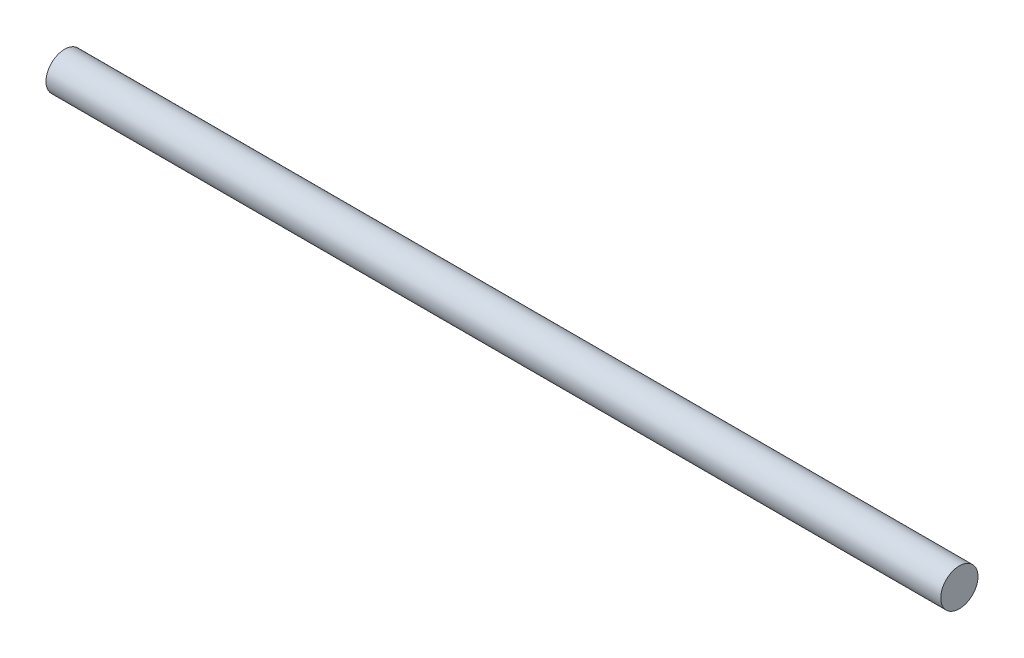
ISO-10303-21;
HEADER;
FILE_DESCRIPTION(('STEP AP214'),'2;1');
FILE_NAME('part.step','',(''),(''),'','','');
FILE_SCHEMA(('AUTOMOTIVE_DESIGN { 1 0 10303 214 1 1 1 1 }'));
ENDSEC;
DATA;
#1=APPLICATION_CONTEXT('core data for automotive mechanical design processes');
#2=APPLICATION_PROTOCOL_DEFINITION('international standard','automotive_design',2000,#1);
#3=PRODUCT_CONTEXT('',#1,'mechanical');
#4=PRODUCT('Part','Part','',(#3));
#5=PRODUCT_RELATED_PRODUCT_CATEGORY('part','',(#4));
#6=PRODUCT_DEFINITION_FORMATION('','',#4);
#7=PRODUCT_DEFINITION_CONTEXT('part definition',#1,'design');
#8=PRODUCT_DEFINITION('design','',#6,#7);
#9=PRODUCT_DEFINITION_SHAPE('','',#8);
#10=(LENGTH_UNIT() NAMED_UNIT(*) SI_UNIT(.MILLI.,.METRE.));
#11=(NAMED_UNIT(*) PLANE_ANGLE_UNIT() SI_UNIT($,.RADIAN.));
#12=(NAMED_UNIT(*) SI_UNIT($,.STERADIAN.) SOLID_ANGLE_UNIT());
#13=UNCERTAINTY_MEASURE_WITH_UNIT(LENGTH_MEASURE(1.E-05),#10,'distance_accuracy_value','');
#14=(GEOMETRIC_REPRESENTATION_CONTEXT(3) GLOBAL_UNCERTAINTY_ASSIGNED_CONTEXT((#13)) GLOBAL_UNIT_ASSIGNED_CONTEXT((#10,
#11,#12)) REPRESENTATION_CONTEXT('',''));
#15=CARTESIAN_POINT('',(0.,0.,0.));
#16=DIRECTION('',(0.,0.,1.));
#17=DIRECTION('',(1.,0.,0.));
#18=AXIS2_PLACEMENT_3D('',#15,#16,#17);
#19=CARTESIAN_POINT('',(60.,0.,0.));
#20=DIRECTION('',(-1.,0.,0.));
#21=DIRECTION('',(0.,0.,1.));
#22=AXIS2_PLACEMENT_3D('',#19,#20,#21);
#23=CYLINDRICAL_SURFACE('',#22,1.25);
#24=CARTESIAN_POINT('',(60.,0.,0.));
#25=DIRECTION('',(1.,0.,0.));
#26=DIRECTION('',(0.,0.,-1.));
#27=AXIS2_PLACEMENT_3D('',#24,#25,#26);
#28=CIRCLE('',#27,1.25);
#29=CARTESIAN_POINT('',(60.,0.,-1.25));
#30=VERTEX_POINT('',#29);
#31=EDGE_CURVE('E10',#30,#30,#28,.T.);
#32=ORIENTED_EDGE('',*,*,#31,.F.);
#33=EDGE_LOOP('',(#32));
#34=FACE_BOUND('',#33,.T.);
#35=CARTESIAN_POINT('',(0.,0.,0.));
#36=DIRECTION('',(1.,0.,0.));
#37=DIRECTION('',(0.,0.,-1.));
#38=AXIS2_PLACEMENT_3D('',#35,#36,#37);
#39=CIRCLE('',#38,1.25);
#40=CARTESIAN_POINT('',(0.,0.,-1.25));
#41=VERTEX_POINT('',#40);
#42=EDGE_CURVE('E35',#41,#41,#39,.T.);
#43=ORIENTED_EDGE('',*,*,#42,.T.);
#44=EDGE_LOOP('',(#43));
#45=FACE_BOUND('',#44,.T.);
#46=ADVANCED_FACE('F32',(#34,#45),#23,.T.);
#47=CARTESIAN_POINT('',(60.,0.,0.));
#48=DIRECTION('',(1.,0.,0.));
#49=DIRECTION('',(0.,0.,-1.));
#50=AXIS2_PLACEMENT_3D('',#47,#48,#49);
#51=PLANE('',#50);
#52=ORIENTED_EDGE('',*,*,#31,.T.);
#53=EDGE_LOOP('',(#52));
#54=FACE_BOUND('',#53,.T.);
#55=ADVANCED_FACE('F47',(#54),#51,.T.);
#56=CARTESIAN_POINT('',(0.,0.,0.));
#57=DIRECTION('',(1.,0.,0.));
#58=DIRECTION('',(0.,0.,-1.));
#59=AXIS2_PLACEMENT_3D('',#56,#57,#58);
#60=PLANE('',#59);
#61=ORIENTED_EDGE('',*,*,#42,.F.);
#62=EDGE_LOOP('',(#61));
#63=FACE_BOUND('',#62,.T.);
#64=ADVANCED_FACE('F45',(#63),#60,.F.);
#65=CLOSED_SHELL('',(#46,#55,#64));
#66=MANIFOLD_SOLID_BREP('B2',#65);
#67=ADVANCED_BREP_SHAPE_REPRESENTATION('',(#18,#66),#14);
#68=SHAPE_DEFINITION_REPRESENTATION(#9,#67);
ENDSEC;
END-ISO-10303-21;
